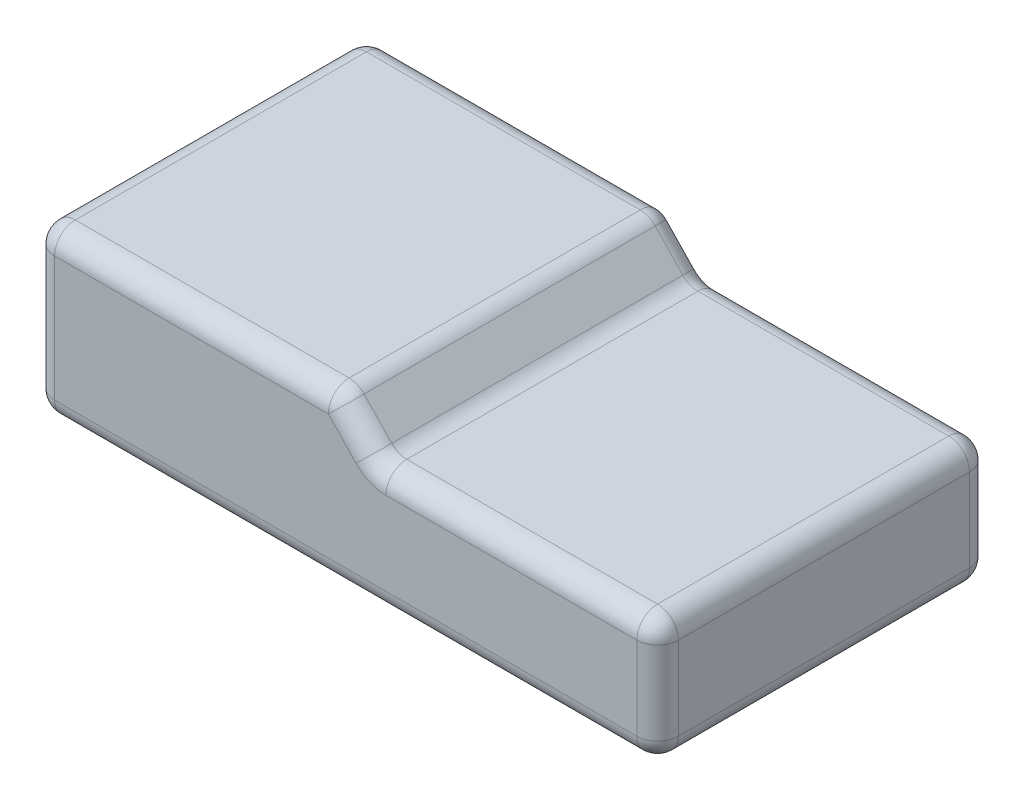
ISO-10303-21;
HEADER;
FILE_DESCRIPTION(('STEP AP214'),'2;1');
FILE_NAME('part.step','',(''),(''),'','','');
FILE_SCHEMA(('AUTOMOTIVE_DESIGN { 1 0 10303 214 1 1 1 1 }'));
ENDSEC;
DATA;
#1=APPLICATION_CONTEXT('core data for automotive mechanical design processes');
#2=APPLICATION_PROTOCOL_DEFINITION('international standard','automotive_design',2000,#1);
#3=PRODUCT_CONTEXT('',#1,'mechanical');
#4=PRODUCT('Part','Part','',(#3));
#5=PRODUCT_RELATED_PRODUCT_CATEGORY('part','',(#4));
#6=PRODUCT_DEFINITION_FORMATION('','',#4);
#7=PRODUCT_DEFINITION_CONTEXT('part definition',#1,'design');
#8=PRODUCT_DEFINITION('design','',#6,#7);
#9=PRODUCT_DEFINITION_SHAPE('','',#8);
#10=(LENGTH_UNIT() NAMED_UNIT(*) SI_UNIT(.MILLI.,.METRE.));
#11=(NAMED_UNIT(*) PLANE_ANGLE_UNIT() SI_UNIT($,.RADIAN.));
#12=(NAMED_UNIT(*) SI_UNIT($,.STERADIAN.) SOLID_ANGLE_UNIT());
#13=UNCERTAINTY_MEASURE_WITH_UNIT(LENGTH_MEASURE(1.E-05),#10,'distance_accuracy_value','');
#14=(GEOMETRIC_REPRESENTATION_CONTEXT(3) GLOBAL_UNCERTAINTY_ASSIGNED_CONTEXT((#13)) GLOBAL_UNIT_ASSIGNED_CONTEXT((#10,
#11,#12)) REPRESENTATION_CONTEXT('',''));
#15=CARTESIAN_POINT('',(0.,0.,0.));
#16=DIRECTION('',(0.,0.,1.));
#17=DIRECTION('',(1.,0.,0.));
#18=AXIS2_PLACEMENT_3D('',#15,#16,#17);
#19=CARTESIAN_POINT('',(38.1,0.,20.32));
#20=DIRECTION('',(0.,1.,0.));
#21=DIRECTION('',(0.,0.,1.));
#22=AXIS2_PLACEMENT_3D('',#19,#20,#21);
#23=PLANE('',#22);
#24=DIRECTION('',(0.,0.,-1.));
#25=VECTOR('',#24,1.);
#26=CARTESIAN_POINT('',(1.27,0.,20.32));
#27=LINE('',#26,#25);
#28=CARTESIAN_POINT('',(1.27,0.,19.05));
#29=VERTEX_POINT('',#28);
#30=CARTESIAN_POINT('',(1.27,0.,1.27));
#31=VERTEX_POINT('',#30);
#32=EDGE_CURVE('E360',#29,#31,#27,.T.);
#33=ORIENTED_EDGE('',*,*,#32,.T.);
#34=DIRECTION('',(1.,0.,0.));
#35=VECTOR('',#34,1.);
#36=CARTESIAN_POINT('',(38.1,0.,1.27));
#37=LINE('',#36,#35);
#38=CARTESIAN_POINT('',(36.83,0.,1.27));
#39=VERTEX_POINT('',#38);
#40=EDGE_CURVE('E363',#31,#39,#37,.T.);
#41=ORIENTED_EDGE('',*,*,#40,.T.);
#42=DIRECTION('',(0.,0.,-1.));
#43=VECTOR('',#42,1.);
#44=CARTESIAN_POINT('',(36.83,0.,20.32));
#45=LINE('',#44,#43);
#46=CARTESIAN_POINT('',(36.83,0.,19.05));
#47=VERTEX_POINT('',#46);
#48=EDGE_CURVE('E358',#39,#47,#45,.F.);
#49=ORIENTED_EDGE('',*,*,#48,.T.);
#50=DIRECTION('',(1.,0.,0.));
#51=VECTOR('',#50,1.);
#52=CARTESIAN_POINT('',(38.1,0.,19.05));
#53=LINE('',#52,#51);
#54=EDGE_CURVE('E294',#47,#29,#53,.F.);
#55=ORIENTED_EDGE('',*,*,#54,.T.);
#56=EDGE_LOOP('',(#33,#41,#49,#55));
#57=FACE_BOUND('',#56,.T.);
#58=ADVANCED_FACE('F35',(#57),#23,.F.);
#59=CARTESIAN_POINT('',(38.1,7.62,20.32));
#60=DIRECTION('',(-1.,0.,0.));
#61=DIRECTION('',(0.,0.,1.));
#62=AXIS2_PLACEMENT_3D('',#59,#60,#61);
#63=PLANE('',#62);
#64=DIRECTION('',(0.,0.,-1.));
#65=VECTOR('',#64,1.);
#66=CARTESIAN_POINT('',(38.1,1.27,20.32));
#67=LINE('',#66,#65);
#68=CARTESIAN_POINT('',(38.1,1.27,19.05));
#69=VERTEX_POINT('',#68);
#70=CARTESIAN_POINT('',(38.1,1.27,1.27));
#71=VERTEX_POINT('',#70);
#72=EDGE_CURVE('E377',#69,#71,#67,.T.);
#73=ORIENTED_EDGE('',*,*,#72,.T.);
#74=DIRECTION('',(0.,1.,0.));
#75=VECTOR('',#74,1.);
#76=CARTESIAN_POINT('',(38.1,7.62,1.27));
#77=LINE('',#76,#75);
#78=CARTESIAN_POINT('',(38.1,6.35,1.27));
#79=VERTEX_POINT('',#78);
#80=EDGE_CURVE('E380',#71,#79,#77,.T.);
#81=ORIENTED_EDGE('',*,*,#80,.T.);
#82=DIRECTION('',(0.,0.,-1.));
#83=VECTOR('',#82,1.);
#84=CARTESIAN_POINT('',(38.1,6.35,20.32));
#85=LINE('',#84,#83);
#86=CARTESIAN_POINT('',(38.1,6.35,19.05));
#87=VERTEX_POINT('',#86);
#88=EDGE_CURVE('E375',#79,#87,#85,.F.);
#89=ORIENTED_EDGE('',*,*,#88,.T.);
#90=DIRECTION('',(0.,1.,0.));
#91=VECTOR('',#90,1.);
#92=CARTESIAN_POINT('',(38.1,7.62,19.05));
#93=LINE('',#92,#91);
#94=EDGE_CURVE('E373',#87,#69,#93,.F.);
#95=ORIENTED_EDGE('',*,*,#94,.T.);
#96=EDGE_LOOP('',(#73,#81,#89,#95));
#97=FACE_BOUND('',#96,.T.);
#98=ADVANCED_FACE('F425',(#97),#63,.F.);
#99=CARTESIAN_POINT('',(20.9680593356964,7.62,20.32));
#100=DIRECTION('',(0.,-1.,0.));
#101=DIRECTION('',(0.,0.,-1.));
#102=AXIS2_PLACEMENT_3D('',#99,#100,#101);
#103=PLANE('',#102);
#104=DIRECTION('',(0.,0.,-1.));
#105=VECTOR('',#104,1.);
#106=CARTESIAN_POINT('',(36.83,7.62,20.32));
#107=LINE('',#106,#105);
#108=CARTESIAN_POINT('',(36.83,7.62,19.05));
#109=VERTEX_POINT('',#108);
#110=CARTESIAN_POINT('',(36.83,7.62,1.27));
#111=VERTEX_POINT('',#110);
#112=EDGE_CURVE('E343',#109,#111,#107,.T.);
#113=ORIENTED_EDGE('',*,*,#112,.T.);
#114=DIRECTION('',(-1.,0.,0.));
#115=VECTOR('',#114,1.);
#116=CARTESIAN_POINT('',(20.9680593356964,7.62,1.27));
#117=LINE('',#116,#115);
#118=CARTESIAN_POINT('',(21.509581964077,7.62,1.27));
#119=VERTEX_POINT('',#118);
#120=EDGE_CURVE('E349',#111,#119,#117,.T.);
#121=ORIENTED_EDGE('',*,*,#120,.T.);
#122=DIRECTION('',(0.,0.,-1.));
#123=VECTOR('',#122,1.);
#124=CARTESIAN_POINT('',(21.509581964077,7.62,20.32));
#125=LINE('',#124,#123);
#126=CARTESIAN_POINT('',(21.509581964077,7.62,19.05));
#127=VERTEX_POINT('',#126);
#128=EDGE_CURVE('E346',#119,#127,#125,.F.);
#129=ORIENTED_EDGE('',*,*,#128,.T.);
#130=DIRECTION('',(-1.,0.,0.));
#131=VECTOR('',#130,1.);
#132=CARTESIAN_POINT('',(20.9680593356964,7.62,19.05));
#133=LINE('',#132,#131);
#134=EDGE_CURVE('E337',#127,#109,#133,.F.);
#135=ORIENTED_EDGE('',*,*,#134,.T.);
#136=EDGE_LOOP('',(#113,#121,#129,#135));
#137=FACE_BOUND('',#136,.T.);
#138=ADVANCED_FACE('F347',(#137),#103,.F.);
#139=CARTESIAN_POINT('',(18.5311284046692,10.16,20.32));
#140=DIRECTION('',(-0.72159579056583,-0.692314606979858,0.));
#141=DIRECTION('',(0.692314606979858,-0.72159579056583,0.));
#142=AXIS2_PLACEMENT_3D('',#139,#140,#141);
#143=PLANE('',#142);
#144=DIRECTION('',(-0.692314606979858,0.72159579056583,0.));
#145=VECTOR('',#144,1.);
#146=CARTESIAN_POINT('',(18.5311284046692,10.16,19.05));
#147=LINE('',#146,#145);
#148=CARTESIAN_POINT('',(18.9060324303073,9.76923955086442,19.05));
#149=VERTEX_POINT('',#148);
#150=CARTESIAN_POINT('',(20.5931553100584,8.01076044913558,19.05));
#151=VERTEX_POINT('',#150);
#152=EDGE_CURVE('E176',#149,#151,#147,.F.);
#153=ORIENTED_EDGE('',*,*,#152,.T.);
#154=DIRECTION('',(0.,0.,-1.));
#155=VECTOR('',#154,1.);
#156=CARTESIAN_POINT('',(20.5931553100584,8.01076044913558,0.));
#157=LINE('',#156,#155);
#158=CARTESIAN_POINT('',(20.5931553100584,8.01076044913558,1.27));
#159=VERTEX_POINT('',#158);
#160=EDGE_CURVE('E172',#151,#159,#157,.T.);
#161=ORIENTED_EDGE('',*,*,#160,.T.);
#162=DIRECTION('',(-0.692314606979858,0.72159579056583,0.));
#163=VECTOR('',#162,1.);
#164=CARTESIAN_POINT('',(18.5311284046692,10.16,1.27));
#165=LINE('',#164,#163);
#166=CARTESIAN_POINT('',(18.9060324303073,9.76923955086442,1.27));
#167=VERTEX_POINT('',#166);
#168=EDGE_CURVE('E166',#159,#167,#165,.T.);
#169=ORIENTED_EDGE('',*,*,#168,.T.);
#170=DIRECTION('',(0.,0.,-1.));
#171=VECTOR('',#170,1.);
#172=CARTESIAN_POINT('',(18.9060324303073,9.76923955086442,20.32));
#173=LINE('',#172,#171);
#174=EDGE_CURVE('E169',#167,#149,#173,.F.);
#175=ORIENTED_EDGE('',*,*,#174,.T.);
#176=EDGE_LOOP('',(#153,#161,#169,#175));
#177=FACE_BOUND('',#176,.T.);
#178=ADVANCED_FACE('F168',(#177),#143,.F.);
#179=CARTESIAN_POINT('',(0.,10.16,20.32));
#180=DIRECTION('',(0.,-1.,0.));
#181=DIRECTION('',(0.,0.,-1.));
#182=AXIS2_PLACEMENT_3D('',#179,#180,#181);
#183=PLANE('',#182);
#184=DIRECTION('',(-1.,0.,0.));
#185=VECTOR('',#184,1.);
#186=CARTESIAN_POINT('',(0.,10.16,19.05));
#187=LINE('',#186,#185);
#188=CARTESIAN_POINT('',(1.27,10.16,19.05));
#189=VERTEX_POINT('',#188);
#190=CARTESIAN_POINT('',(17.9896057762887,10.16,19.05));
#191=VERTEX_POINT('',#190);
#192=EDGE_CURVE('E44',#189,#191,#187,.F.);
#193=ORIENTED_EDGE('',*,*,#192,.T.);
#194=DIRECTION('',(0.,0.,-1.));
#195=VECTOR('',#194,1.);
#196=CARTESIAN_POINT('',(17.9896057762887,10.16,20.32));
#197=LINE('',#196,#195);
#198=CARTESIAN_POINT('',(17.9896057762887,10.16,1.27));
#199=VERTEX_POINT('',#198);
#200=EDGE_CURVE('E11',#191,#199,#197,.T.);
#201=ORIENTED_EDGE('',*,*,#200,.T.);
#202=DIRECTION('',(-1.,0.,0.));
#203=VECTOR('',#202,1.);
#204=CARTESIAN_POINT('',(0.,10.16,1.27));
#205=LINE('',#204,#203);
#206=CARTESIAN_POINT('',(1.27,10.16,1.27));
#207=VERTEX_POINT('',#206);
#208=EDGE_CURVE('E313',#199,#207,#205,.T.);
#209=ORIENTED_EDGE('',*,*,#208,.T.);
#210=DIRECTION('',(0.,0.,-1.));
#211=VECTOR('',#210,1.);
#212=CARTESIAN_POINT('',(1.27,10.16,20.32));
#213=LINE('',#212,#211);
#214=EDGE_CURVE('E55',#207,#189,#213,.F.);
#215=ORIENTED_EDGE('',*,*,#214,.T.);
#216=EDGE_LOOP('',(#193,#201,#209,#215));
#217=FACE_BOUND('',#216,.T.);
#218=ADVANCED_FACE('F466',(#217),#183,.F.);
#219=CARTESIAN_POINT('',(0.,0.,20.32));
#220=DIRECTION('',(1.,0.,0.));
#221=DIRECTION('',(0.,0.,-1.));
#222=AXIS2_PLACEMENT_3D('',#219,#220,#221);
#223=PLANE('',#222);
#224=DIRECTION('',(0.,-1.,0.));
#225=VECTOR('',#224,1.);
#226=CARTESIAN_POINT('',(0.,0.,1.27));
#227=LINE('',#226,#225);
#228=CARTESIAN_POINT('',(0.,8.89,1.27));
#229=VERTEX_POINT('',#228);
#230=CARTESIAN_POINT('',(0.,1.27,1.27));
#231=VERTEX_POINT('',#230);
#232=EDGE_CURVE('E369',#229,#231,#227,.T.);
#233=ORIENTED_EDGE('',*,*,#232,.T.);
#234=DIRECTION('',(0.,0.,-1.));
#235=VECTOR('',#234,1.);
#236=CARTESIAN_POINT('',(0.,1.27,20.32));
#237=LINE('',#236,#235);
#238=CARTESIAN_POINT('',(0.,1.27,19.05));
#239=VERTEX_POINT('',#238);
#240=EDGE_CURVE('E371',#231,#239,#237,.F.);
#241=ORIENTED_EDGE('',*,*,#240,.T.);
#242=DIRECTION('',(0.,-1.,0.));
#243=VECTOR('',#242,1.);
#244=CARTESIAN_POINT('',(0.,0.,19.05));
#245=LINE('',#244,#243);
#246=CARTESIAN_POINT('',(0.,8.89,19.05));
#247=VERTEX_POINT('',#246);
#248=EDGE_CURVE('E367',#239,#247,#245,.F.);
#249=ORIENTED_EDGE('',*,*,#248,.T.);
#250=DIRECTION('',(0.,0.,-1.));
#251=VECTOR('',#250,1.);
#252=CARTESIAN_POINT('',(0.,8.89,20.32));
#253=LINE('',#252,#251);
#254=EDGE_CURVE('E365',#247,#229,#253,.T.);
#255=ORIENTED_EDGE('',*,*,#254,.T.);
#256=EDGE_LOOP('',(#233,#241,#249,#255));
#257=FACE_BOUND('',#256,.T.);
#258=ADVANCED_FACE('F468',(#257),#223,.F.);
#259=CARTESIAN_POINT('',(0.,0.,20.32));
#260=DIRECTION('',(0.,0.,-1.));
#261=DIRECTION('',(-1.,0.,0.));
#262=AXIS2_PLACEMENT_3D('',#259,#260,#261);
#263=PLANE('',#262);
#264=DIRECTION('',(0.,1.,0.));
#265=VECTOR('',#264,1.);
#266=CARTESIAN_POINT('',(36.83,0.,20.32));
#267=LINE('',#266,#265);
#268=CARTESIAN_POINT('',(36.83,1.27,20.32));
#269=VERTEX_POINT('',#268);
#270=CARTESIAN_POINT('',(36.83,6.35,20.32));
#271=VERTEX_POINT('',#270);
#272=EDGE_CURVE('E300',#269,#271,#267,.T.);
#273=ORIENTED_EDGE('',*,*,#272,.T.);
#274=DIRECTION('',(-1.,0.,0.));
#275=VECTOR('',#274,1.);
#276=CARTESIAN_POINT('',(0.,6.35,20.32));
#277=LINE('',#276,#275);
#278=CARTESIAN_POINT('',(21.509581964077,6.35,20.32));
#279=VERTEX_POINT('',#278);
#280=EDGE_CURVE('E311',#271,#279,#277,.T.);
#281=ORIENTED_EDGE('',*,*,#280,.T.);
#282=CARTESIAN_POINT('',(21.509581964077,8.89,20.32));
#283=DIRECTION('',(0.,0.,-1.));
#284=DIRECTION('',(-1.,0.,0.));
#285=AXIS2_PLACEMENT_3D('',#282,#283,#284);
#286=CIRCLE('',#285,2.54);
#287=CARTESIAN_POINT('',(19.6767286560398,7.13152089827116,20.32));
#288=VERTEX_POINT('',#287);
#289=EDGE_CURVE('E303',#288,#279,#286,.F.);
#290=ORIENTED_EDGE('',*,*,#289,.F.);
#291=DIRECTION('',(-0.692314606979858,0.72159579056583,0.));
#292=VECTOR('',#291,1.);
#293=CARTESIAN_POINT('',(13.8083853636138,13.2480635433593,20.32));
#294=LINE('',#293,#292);
#295=CARTESIAN_POINT('',(17.9896057762887,8.89,20.32));
#296=VERTEX_POINT('',#295);
#297=EDGE_CURVE('E305',#288,#296,#294,.T.);
#298=ORIENTED_EDGE('',*,*,#297,.T.);
#299=DIRECTION('',(-1.,0.,0.));
#300=VECTOR('',#299,1.);
#301=CARTESIAN_POINT('',(0.,8.89,20.32));
#302=LINE('',#301,#300);
#303=CARTESIAN_POINT('',(1.27,8.89,20.32));
#304=VERTEX_POINT('',#303);
#305=EDGE_CURVE('E397',#296,#304,#302,.T.);
#306=ORIENTED_EDGE('',*,*,#305,.T.);
#307=DIRECTION('',(0.,-1.,0.));
#308=VECTOR('',#307,1.);
#309=CARTESIAN_POINT('',(1.27,0.,20.32));
#310=LINE('',#309,#308);
#311=CARTESIAN_POINT('',(1.27,1.27,20.32));
#312=VERTEX_POINT('',#311);
#313=EDGE_CURVE('E301',#304,#312,#310,.T.);
#314=ORIENTED_EDGE('',*,*,#313,.T.);
#315=DIRECTION('',(1.,0.,0.));
#316=VECTOR('',#315,1.);
#317=CARTESIAN_POINT('',(0.,1.27,20.32));
#318=LINE('',#317,#316);
#319=EDGE_CURVE('E296',#312,#269,#318,.T.);
#320=ORIENTED_EDGE('',*,*,#319,.T.);
#321=EDGE_LOOP('',(#273,#281,#290,#298,#306,#314,#320));
#322=FACE_BOUND('',#321,.T.);
#323=ADVANCED_FACE('F400',(#322),#263,.F.);
#324=CARTESIAN_POINT('',(0.,0.,0.));
#325=DIRECTION('',(0.,0.,-1.));
#326=DIRECTION('',(-1.,0.,0.));
#327=AXIS2_PLACEMENT_3D('',#324,#325,#326);
#328=PLANE('',#327);
#329=DIRECTION('',(-1.,0.,0.));
#330=VECTOR('',#329,1.);
#331=CARTESIAN_POINT('',(38.1,6.35,0.));
#332=LINE('',#331,#330);
#333=CARTESIAN_POINT('',(21.509581964077,6.35,0.));
#334=VERTEX_POINT('',#333);
#335=CARTESIAN_POINT('',(36.83,6.35,0.));
#336=VERTEX_POINT('',#335);
#337=EDGE_CURVE('E392',#334,#336,#332,.F.);
#338=ORIENTED_EDGE('',*,*,#337,.T.);
#339=DIRECTION('',(0.,1.,0.));
#340=VECTOR('',#339,1.);
#341=CARTESIAN_POINT('',(36.83,0.,0.));
#342=LINE('',#341,#340);
#343=CARTESIAN_POINT('',(36.83,1.27,0.));
#344=VERTEX_POINT('',#343);
#345=EDGE_CURVE('E394',#336,#344,#342,.F.);
#346=ORIENTED_EDGE('',*,*,#345,.T.);
#347=DIRECTION('',(1.,0.,0.));
#348=VECTOR('',#347,1.);
#349=CARTESIAN_POINT('',(0.,1.27,0.));
#350=LINE('',#349,#348);
#351=CARTESIAN_POINT('',(1.27,1.27,0.));
#352=VERTEX_POINT('',#351);
#353=EDGE_CURVE('E387',#344,#352,#350,.F.);
#354=ORIENTED_EDGE('',*,*,#353,.T.);
#355=DIRECTION('',(0.,-1.,0.));
#356=VECTOR('',#355,1.);
#357=CARTESIAN_POINT('',(1.27,10.16,0.));
#358=LINE('',#357,#356);
#359=CARTESIAN_POINT('',(1.27,8.89,0.));
#360=VERTEX_POINT('',#359);
#361=EDGE_CURVE('E384',#352,#360,#358,.F.);
#362=ORIENTED_EDGE('',*,*,#361,.T.);
#363=DIRECTION('',(-1.,0.,0.));
#364=VECTOR('',#363,1.);
#365=CARTESIAN_POINT('',(18.5311284046692,8.89,0.));
#366=LINE('',#365,#364);
#367=CARTESIAN_POINT('',(17.9896057762887,8.89,0.));
#368=VERTEX_POINT('',#367);
#369=EDGE_CURVE('E382',#360,#368,#366,.F.);
#370=ORIENTED_EDGE('',*,*,#369,.T.);
#371=DIRECTION('',(-0.692314606979858,0.72159579056583,0.));
#372=VECTOR('',#371,1.);
#373=CARTESIAN_POINT('',(20.0516326816778,6.74076044913558,0.));
#374=LINE('',#373,#372);
#375=CARTESIAN_POINT('',(19.6767286560398,7.13152089827116,0.));
#376=VERTEX_POINT('',#375);
#377=EDGE_CURVE('E197',#368,#376,#374,.F.);
#378=ORIENTED_EDGE('',*,*,#377,.T.);
#379=CARTESIAN_POINT('',(21.509581964077,8.89,0.));
#380=DIRECTION('',(0.,0.,-1.));
#381=DIRECTION('',(-1.,0.,0.));
#382=AXIS2_PLACEMENT_3D('',#379,#380,#381);
#383=CIRCLE('',#382,2.54);
#384=EDGE_CURVE('E389',#334,#376,#383,.T.);
#385=ORIENTED_EDGE('',*,*,#384,.F.);
#386=EDGE_LOOP('',(#338,#346,#354,#362,#370,#378,#385));
#387=FACE_BOUND('',#386,.T.);
#388=ADVANCED_FACE('F458',(#387),#328,.T.);
#389=CARTESIAN_POINT('',(1.27,1.27,20.32));
#390=DIRECTION('',(0.,0.,-1.));
#391=DIRECTION('',(-1.,0.,0.));
#392=AXIS2_PLACEMENT_3D('',#389,#390,#391);
#393=CYLINDRICAL_SURFACE('',#392,1.27);
#394=CARTESIAN_POINT('',(1.27,1.27,19.05));
#395=DIRECTION('',(0.,0.,1.));
#396=DIRECTION('',(1.,0.,0.));
#397=AXIS2_PLACEMENT_3D('',#394,#395,#396);
#398=CIRCLE('',#397,1.27);
#399=EDGE_CURVE('E39',#239,#29,#398,.T.);
#400=ORIENTED_EDGE('',*,*,#399,.F.);
#401=ORIENTED_EDGE('',*,*,#240,.F.);
#402=CARTESIAN_POINT('',(1.27,1.27,1.27));
#403=DIRECTION('',(0.,0.,-1.));
#404=DIRECTION('',(-1.,0.,0.));
#405=AXIS2_PLACEMENT_3D('',#402,#403,#404);
#406=CIRCLE('',#405,1.27);
#407=EDGE_CURVE('E274',#31,#231,#406,.T.);
#408=ORIENTED_EDGE('',*,*,#407,.F.);
#409=ORIENTED_EDGE('',*,*,#32,.F.);
#410=EDGE_LOOP('',(#400,#401,#408,#409));
#411=FACE_BOUND('',#410,.T.);
#412=ADVANCED_FACE('F37',(#411),#393,.T.);
#413=CARTESIAN_POINT('',(1.27,1.27,19.05));
#414=DIRECTION('',(0.,0.,1.));
#415=DIRECTION('',(1.,0.,0.));
#416=AXIS2_PLACEMENT_3D('',#413,#414,#415);
#417=SPHERICAL_SURFACE('',#416,1.27);
#418=CARTESIAN_POINT('',(1.27,1.27,19.05));
#419=DIRECTION('',(0.,-1.,0.));
#420=DIRECTION('',(0.,0.,-1.));
#421=AXIS2_PLACEMENT_3D('',#418,#419,#420);
#422=CIRCLE('',#421,1.27);
#423=EDGE_CURVE('E269',#239,#312,#422,.F.);
#424=ORIENTED_EDGE('',*,*,#423,.F.);
#425=ORIENTED_EDGE('',*,*,#399,.T.);
#426=CARTESIAN_POINT('',(1.27,1.27,19.05));
#427=DIRECTION('',(-1.,0.,0.));
#428=DIRECTION('',(0.,0.,1.));
#429=AXIS2_PLACEMENT_3D('',#426,#427,#428);
#430=CIRCLE('',#429,1.27);
#431=EDGE_CURVE('E272',#312,#29,#430,.F.);
#432=ORIENTED_EDGE('',*,*,#431,.F.);
#433=EDGE_LOOP('',(#424,#425,#432));
#434=FACE_BOUND('',#433,.T.);
#435=ADVANCED_FACE('F285',(#434),#417,.T.);
#436=CARTESIAN_POINT('',(1.27,1.27,1.27));
#437=DIRECTION('',(0.,0.,1.));
#438=DIRECTION('',(1.,0.,0.));
#439=AXIS2_PLACEMENT_3D('',#436,#437,#438);
#440=SPHERICAL_SURFACE('',#439,1.27);
#441=CARTESIAN_POINT('',(1.27,1.27,1.27));
#442=DIRECTION('',(-1.,0.,0.));
#443=DIRECTION('',(0.,-1.,0.));
#444=AXIS2_PLACEMENT_3D('',#441,#442,#443);
#445=CIRCLE('',#444,1.27);
#446=EDGE_CURVE('E263',#31,#352,#445,.F.);
#447=ORIENTED_EDGE('',*,*,#446,.F.);
#448=ORIENTED_EDGE('',*,*,#407,.T.);
#449=CARTESIAN_POINT('',(1.27,1.27,1.27));
#450=DIRECTION('',(0.,-1.,0.));
#451=DIRECTION('',(0.,0.,-1.));
#452=AXIS2_PLACEMENT_3D('',#449,#450,#451);
#453=CIRCLE('',#452,1.27);
#454=EDGE_CURVE('E266',#352,#231,#453,.F.);
#455=ORIENTED_EDGE('',*,*,#454,.F.);
#456=EDGE_LOOP('',(#447,#448,#455));
#457=FACE_BOUND('',#456,.T.);
#458=ADVANCED_FACE('F528',(#457),#440,.T.);
#459=CARTESIAN_POINT('',(0.,1.27,19.05));
#460=DIRECTION('',(1.,0.,0.));
#461=DIRECTION('',(0.,0.,-1.));
#462=AXIS2_PLACEMENT_3D('',#459,#460,#461);
#463=CYLINDRICAL_SURFACE('',#462,1.27);
#464=ORIENTED_EDGE('',*,*,#431,.T.);
#465=ORIENTED_EDGE('',*,*,#54,.F.);
#466=CARTESIAN_POINT('',(36.83,1.27,19.05));
#467=DIRECTION('',(1.,0.,0.));
#468=DIRECTION('',(0.,0.,-1.));
#469=AXIS2_PLACEMENT_3D('',#466,#467,#468);
#470=CIRCLE('',#469,1.27);
#471=EDGE_CURVE('E257',#269,#47,#470,.T.);
#472=ORIENTED_EDGE('',*,*,#471,.F.);
#473=ORIENTED_EDGE('',*,*,#319,.F.);
#474=EDGE_LOOP('',(#464,#465,#472,#473));
#475=FACE_BOUND('',#474,.T.);
#476=ADVANCED_FACE('F292',(#475),#463,.T.);
#477=CARTESIAN_POINT('',(1.27,0.,19.05));
#478=DIRECTION('',(0.,-1.,0.));
#479=DIRECTION('',(0.,0.,-1.));
#480=AXIS2_PLACEMENT_3D('',#477,#478,#479);
#481=CYLINDRICAL_SURFACE('',#480,1.27);
#482=ORIENTED_EDGE('',*,*,#423,.T.);
#483=ORIENTED_EDGE('',*,*,#313,.F.);
#484=CARTESIAN_POINT('',(1.27,8.89,19.05));
#485=DIRECTION('',(0.,1.,0.));
#486=DIRECTION('',(0.,0.,1.));
#487=AXIS2_PLACEMENT_3D('',#484,#485,#486);
#488=CIRCLE('',#487,1.27);
#489=EDGE_CURVE('E254',#247,#304,#488,.T.);
#490=ORIENTED_EDGE('',*,*,#489,.F.);
#491=ORIENTED_EDGE('',*,*,#248,.F.);
#492=EDGE_LOOP('',(#482,#483,#490,#491));
#493=FACE_BOUND('',#492,.T.);
#494=ADVANCED_FACE('F544',(#493),#481,.T.);
#495=CARTESIAN_POINT('',(1.27,8.89,20.32));
#496=DIRECTION('',(0.,0.,-1.));
#497=DIRECTION('',(-1.,0.,0.));
#498=AXIS2_PLACEMENT_3D('',#495,#496,#497);
#499=CYLINDRICAL_SURFACE('',#498,1.27);
#500=CARTESIAN_POINT('',(1.27,8.89,1.27));
#501=DIRECTION('',(0.,0.,-1.));
#502=DIRECTION('',(-1.,0.,0.));
#503=AXIS2_PLACEMENT_3D('',#500,#501,#502);
#504=CIRCLE('',#503,1.27);
#505=EDGE_CURVE('E248',#229,#207,#504,.T.);
#506=ORIENTED_EDGE('',*,*,#505,.F.);
#507=ORIENTED_EDGE('',*,*,#254,.F.);
#508=CARTESIAN_POINT('',(1.27,8.89,19.05));
#509=DIRECTION('',(0.,0.,1.));
#510=DIRECTION('',(1.,0.,0.));
#511=AXIS2_PLACEMENT_3D('',#508,#509,#510);
#512=CIRCLE('',#511,1.27);
#513=EDGE_CURVE('E251',#189,#247,#512,.T.);
#514=ORIENTED_EDGE('',*,*,#513,.F.);
#515=ORIENTED_EDGE('',*,*,#214,.F.);
#516=EDGE_LOOP('',(#506,#507,#514,#515));
#517=FACE_BOUND('',#516,.T.);
#518=ADVANCED_FACE('F553',(#517),#499,.T.);
#519=CARTESIAN_POINT('',(1.27,0.,1.27));
#520=DIRECTION('',(0.,1.,0.));
#521=DIRECTION('',(0.,0.,1.));
#522=AXIS2_PLACEMENT_3D('',#519,#520,#521);
#523=CYLINDRICAL_SURFACE('',#522,1.27);
#524=ORIENTED_EDGE('',*,*,#454,.T.);
#525=ORIENTED_EDGE('',*,*,#232,.F.);
#526=CARTESIAN_POINT('',(1.27,8.89,1.27));
#527=DIRECTION('',(0.,1.,0.));
#528=DIRECTION('',(0.,0.,1.));
#529=AXIS2_PLACEMENT_3D('',#526,#527,#528);
#530=CIRCLE('',#529,1.27);
#531=EDGE_CURVE('E245',#360,#229,#530,.T.);
#532=ORIENTED_EDGE('',*,*,#531,.F.);
#533=ORIENTED_EDGE('',*,*,#361,.F.);
#534=EDGE_LOOP('',(#524,#525,#532,#533));
#535=FACE_BOUND('',#534,.T.);
#536=ADVANCED_FACE('F563',(#535),#523,.T.);
#537=CARTESIAN_POINT('',(38.1,1.27,1.27));
#538=DIRECTION('',(-1.,0.,0.));
#539=DIRECTION('',(0.,0.,1.));
#540=AXIS2_PLACEMENT_3D('',#537,#538,#539);
#541=CYLINDRICAL_SURFACE('',#540,1.27);
#542=ORIENTED_EDGE('',*,*,#446,.T.);
#543=ORIENTED_EDGE('',*,*,#353,.F.);
#544=CARTESIAN_POINT('',(36.83,1.27,1.27));
#545=DIRECTION('',(1.,0.,0.));
#546=DIRECTION('',(0.,0.,-1.));
#547=AXIS2_PLACEMENT_3D('',#544,#545,#546);
#548=CIRCLE('',#547,1.27);
#549=EDGE_CURVE('E242',#39,#344,#548,.T.);
#550=ORIENTED_EDGE('',*,*,#549,.F.);
#551=ORIENTED_EDGE('',*,*,#40,.F.);
#552=EDGE_LOOP('',(#542,#543,#550,#551));
#553=FACE_BOUND('',#552,.T.);
#554=ADVANCED_FACE('F573',(#553),#541,.T.);
#555=CARTESIAN_POINT('',(36.83,1.27,20.32));
#556=DIRECTION('',(0.,0.,-1.));
#557=DIRECTION('',(-1.,0.,0.));
#558=AXIS2_PLACEMENT_3D('',#555,#556,#557);
#559=CYLINDRICAL_SURFACE('',#558,1.27);
#560=CARTESIAN_POINT('',(36.83,1.27,19.05));
#561=DIRECTION('',(0.,0.,1.));
#562=DIRECTION('',(1.,0.,0.));
#563=AXIS2_PLACEMENT_3D('',#560,#561,#562);
#564=CIRCLE('',#563,1.27);
#565=EDGE_CURVE('E260',#47,#69,#564,.T.);
#566=ORIENTED_EDGE('',*,*,#565,.F.);
#567=ORIENTED_EDGE('',*,*,#48,.F.);
#568=CARTESIAN_POINT('',(36.83,1.27,1.27));
#569=DIRECTION('',(0.,0.,-1.));
#570=DIRECTION('',(-1.,0.,0.));
#571=AXIS2_PLACEMENT_3D('',#568,#569,#570);
#572=CIRCLE('',#571,1.27);
#573=EDGE_CURVE('E239',#71,#39,#572,.T.);
#574=ORIENTED_EDGE('',*,*,#573,.F.);
#575=ORIENTED_EDGE('',*,*,#72,.F.);
#576=EDGE_LOOP('',(#566,#567,#574,#575));
#577=FACE_BOUND('',#576,.T.);
#578=ADVANCED_FACE('F583',(#577),#559,.T.);
#579=CARTESIAN_POINT('',(36.83,1.27,19.05));
#580=DIRECTION('',(0.,0.,1.));
#581=DIRECTION('',(1.,0.,0.));
#582=AXIS2_PLACEMENT_3D('',#579,#580,#581);
#583=SPHERICAL_SURFACE('',#582,1.27);
#584=ORIENTED_EDGE('',*,*,#471,.T.);
#585=ORIENTED_EDGE('',*,*,#565,.T.);
#586=CARTESIAN_POINT('',(36.83,1.27,19.05));
#587=DIRECTION('',(0.,-1.,0.));
#588=DIRECTION('',(0.,0.,-1.));
#589=AXIS2_PLACEMENT_3D('',#586,#587,#588);
#590=CIRCLE('',#589,1.27);
#591=EDGE_CURVE('E236',#269,#69,#590,.F.);
#592=ORIENTED_EDGE('',*,*,#591,.F.);
#593=EDGE_LOOP('',(#584,#585,#592));
#594=FACE_BOUND('',#593,.T.);
#595=ADVANCED_FACE('F593',(#594),#583,.T.);
#596=CARTESIAN_POINT('',(1.27,8.89,19.05));
#597=DIRECTION('',(0.,0.,1.));
#598=DIRECTION('',(1.,0.,0.));
#599=AXIS2_PLACEMENT_3D('',#596,#597,#598);
#600=SPHERICAL_SURFACE('',#599,1.27);
#601=ORIENTED_EDGE('',*,*,#513,.T.);
#602=ORIENTED_EDGE('',*,*,#489,.T.);
#603=CARTESIAN_POINT('',(1.27,8.89,19.05));
#604=DIRECTION('',(-1.,0.,0.));
#605=DIRECTION('',(0.,0.,1.));
#606=AXIS2_PLACEMENT_3D('',#603,#604,#605);
#607=CIRCLE('',#606,1.27);
#608=EDGE_CURVE('E233',#189,#304,#607,.F.);
#609=ORIENTED_EDGE('',*,*,#608,.F.);
#610=EDGE_LOOP('',(#601,#602,#609));
#611=FACE_BOUND('',#610,.T.);
#612=ADVANCED_FACE('F603',(#611),#600,.T.);
#613=CARTESIAN_POINT('',(1.27,8.89,1.27));
#614=DIRECTION('',(0.,0.,1.));
#615=DIRECTION('',(1.,0.,0.));
#616=AXIS2_PLACEMENT_3D('',#613,#614,#615);
#617=SPHERICAL_SURFACE('',#616,1.27);
#618=ORIENTED_EDGE('',*,*,#531,.T.);
#619=ORIENTED_EDGE('',*,*,#505,.T.);
#620=CARTESIAN_POINT('',(1.27,8.89,1.27));
#621=DIRECTION('',(-1.,0.,0.));
#622=DIRECTION('',(0.,0.,1.));
#623=AXIS2_PLACEMENT_3D('',#620,#621,#622);
#624=CIRCLE('',#623,1.27);
#625=EDGE_CURVE('E230',#360,#207,#624,.F.);
#626=ORIENTED_EDGE('',*,*,#625,.F.);
#627=EDGE_LOOP('',(#618,#619,#626));
#628=FACE_BOUND('',#627,.T.);
#629=ADVANCED_FACE('F613',(#628),#617,.T.);
#630=CARTESIAN_POINT('',(36.83,1.27,1.27));
#631=DIRECTION('',(0.,0.,1.));
#632=DIRECTION('',(1.,0.,0.));
#633=AXIS2_PLACEMENT_3D('',#630,#631,#632);
#634=SPHERICAL_SURFACE('',#633,1.27);
#635=ORIENTED_EDGE('',*,*,#573,.T.);
#636=ORIENTED_EDGE('',*,*,#549,.T.);
#637=CARTESIAN_POINT('',(36.83,1.27,1.27));
#638=DIRECTION('',(0.,-1.,0.));
#639=DIRECTION('',(1.,0.,0.));
#640=AXIS2_PLACEMENT_3D('',#637,#638,#639);
#641=CIRCLE('',#640,1.27);
#642=EDGE_CURVE('E228',#71,#344,#641,.F.);
#643=ORIENTED_EDGE('',*,*,#642,.F.);
#644=EDGE_LOOP('',(#635,#636,#643));
#645=FACE_BOUND('',#644,.T.);
#646=ADVANCED_FACE('F623',(#645),#634,.T.);
#647=CARTESIAN_POINT('',(36.83,0.,19.05));
#648=DIRECTION('',(0.,1.,0.));
#649=DIRECTION('',(0.,0.,1.));
#650=AXIS2_PLACEMENT_3D('',#647,#648,#649);
#651=CYLINDRICAL_SURFACE('',#650,1.27);
#652=ORIENTED_EDGE('',*,*,#591,.T.);
#653=ORIENTED_EDGE('',*,*,#94,.F.);
#654=CARTESIAN_POINT('',(36.83,6.35,19.05));
#655=DIRECTION('',(0.,1.,0.));
#656=DIRECTION('',(0.,0.,1.));
#657=AXIS2_PLACEMENT_3D('',#654,#655,#656);
#658=CIRCLE('',#657,1.27);
#659=EDGE_CURVE('E222',#271,#87,#658,.T.);
#660=ORIENTED_EDGE('',*,*,#659,.F.);
#661=ORIENTED_EDGE('',*,*,#272,.F.);
#662=EDGE_LOOP('',(#652,#653,#660,#661));
#663=FACE_BOUND('',#662,.T.);
#664=ADVANCED_FACE('F633',(#663),#651,.T.);
#665=CARTESIAN_POINT('',(0.,8.89,19.05));
#666=DIRECTION('',(-1.,0.,0.));
#667=DIRECTION('',(0.,0.,1.));
#668=AXIS2_PLACEMENT_3D('',#665,#666,#667);
#669=CYLINDRICAL_SURFACE('',#668,1.27);
#670=ORIENTED_EDGE('',*,*,#608,.T.);
#671=ORIENTED_EDGE('',*,*,#305,.F.);
#672=CARTESIAN_POINT('',(17.9896057762887,8.89,19.05));
#673=DIRECTION('',(1.,0.,0.));
#674=DIRECTION('',(0.,0.,-1.));
#675=AXIS2_PLACEMENT_3D('',#672,#673,#674);
#676=CIRCLE('',#675,1.27);
#677=EDGE_CURVE('E219',#191,#296,#676,.T.);
#678=ORIENTED_EDGE('',*,*,#677,.F.);
#679=ORIENTED_EDGE('',*,*,#192,.F.);
#680=EDGE_LOOP('',(#670,#671,#678,#679));
#681=FACE_BOUND('',#680,.T.);
#682=ADVANCED_FACE('F406',(#681),#669,.T.);
#683=CARTESIAN_POINT('',(17.9896057762887,8.89,20.32));
#684=DIRECTION('',(0.,0.,-1.));
#685=DIRECTION('',(-1.,0.,0.));
#686=AXIS2_PLACEMENT_3D('',#683,#684,#685);
#687=CYLINDRICAL_SURFACE('',#686,1.27);
#688=CARTESIAN_POINT('',(17.9896057762887,8.89,1.27));
#689=DIRECTION('',(0.,0.,-1.));
#690=DIRECTION('',(-1.,0.,0.));
#691=AXIS2_PLACEMENT_3D('',#688,#689,#690);
#692=CIRCLE('',#691,1.27);
#693=EDGE_CURVE('E182',#199,#167,#692,.T.);
#694=ORIENTED_EDGE('',*,*,#693,.F.);
#695=ORIENTED_EDGE('',*,*,#200,.F.);
#696=CARTESIAN_POINT('',(17.9896057762887,8.89,19.05));
#697=DIRECTION('',(0.,0.,1.));
#698=DIRECTION('',(1.,0.,0.));
#699=AXIS2_PLACEMENT_3D('',#696,#697,#698);
#700=CIRCLE('',#699,1.27);
#701=EDGE_CURVE('E185',#149,#191,#700,.T.);
#702=ORIENTED_EDGE('',*,*,#701,.F.);
#703=ORIENTED_EDGE('',*,*,#174,.F.);
#704=EDGE_LOOP('',(#694,#695,#702,#703));
#705=FACE_BOUND('',#704,.T.);
#706=ADVANCED_FACE('F181',(#705),#687,.T.);
#707=CARTESIAN_POINT('',(0.,8.89,1.27));
#708=DIRECTION('',(1.,0.,0.));
#709=DIRECTION('',(0.,0.,-1.));
#710=AXIS2_PLACEMENT_3D('',#707,#708,#709);
#711=CYLINDRICAL_SURFACE('',#710,1.27);
#712=ORIENTED_EDGE('',*,*,#625,.T.);
#713=ORIENTED_EDGE('',*,*,#208,.F.);
#714=CARTESIAN_POINT('',(17.9896057762887,8.89,1.27));
#715=DIRECTION('',(1.,0.,0.));
#716=DIRECTION('',(0.,1.,0.));
#717=AXIS2_PLACEMENT_3D('',#714,#715,#716);
#718=CIRCLE('',#717,1.27);
#719=EDGE_CURVE('E194',#368,#199,#718,.T.);
#720=ORIENTED_EDGE('',*,*,#719,.F.);
#721=ORIENTED_EDGE('',*,*,#369,.F.);
#722=EDGE_LOOP('',(#712,#713,#720,#721));
#723=FACE_BOUND('',#722,.T.);
#724=ADVANCED_FACE('F464',(#723),#711,.T.);
#725=CARTESIAN_POINT('',(36.83,7.62,1.27));
#726=DIRECTION('',(0.,-1.,0.));
#727=DIRECTION('',(0.,0.,-1.));
#728=AXIS2_PLACEMENT_3D('',#725,#726,#727);
#729=CYLINDRICAL_SURFACE('',#728,1.27);
#730=ORIENTED_EDGE('',*,*,#642,.T.);
#731=ORIENTED_EDGE('',*,*,#345,.F.);
#732=CARTESIAN_POINT('',(36.83,6.35,1.27));
#733=DIRECTION('',(0.,1.,0.));
#734=DIRECTION('',(0.,0.,1.));
#735=AXIS2_PLACEMENT_3D('',#732,#733,#734);
#736=CIRCLE('',#735,1.27);
#737=EDGE_CURVE('E214',#79,#336,#736,.T.);
#738=ORIENTED_EDGE('',*,*,#737,.F.);
#739=ORIENTED_EDGE('',*,*,#80,.F.);
#740=EDGE_LOOP('',(#730,#731,#738,#739));
#741=FACE_BOUND('',#740,.T.);
#742=ADVANCED_FACE('F455',(#741),#729,.T.);
#743=CARTESIAN_POINT('',(36.83,6.35,20.32));
#744=DIRECTION('',(0.,0.,-1.));
#745=DIRECTION('',(-1.,0.,0.));
#746=AXIS2_PLACEMENT_3D('',#743,#744,#745);
#747=CYLINDRICAL_SURFACE('',#746,1.27);
#748=CARTESIAN_POINT('',(36.83,6.35,19.05));
#749=DIRECTION('',(0.,0.,1.));
#750=DIRECTION('',(1.,0.,0.));
#751=AXIS2_PLACEMENT_3D('',#748,#749,#750);
#752=CIRCLE('',#751,1.27);
#753=EDGE_CURVE('E225',#87,#109,#752,.T.);
#754=ORIENTED_EDGE('',*,*,#753,.F.);
#755=ORIENTED_EDGE('',*,*,#88,.F.);
#756=CARTESIAN_POINT('',(36.83,6.35,1.27));
#757=DIRECTION('',(0.,0.,-1.));
#758=DIRECTION('',(-1.,0.,0.));
#759=AXIS2_PLACEMENT_3D('',#756,#757,#758);
#760=CIRCLE('',#759,1.27);
#761=EDGE_CURVE('E211',#111,#79,#760,.T.);
#762=ORIENTED_EDGE('',*,*,#761,.F.);
#763=ORIENTED_EDGE('',*,*,#112,.F.);
#764=EDGE_LOOP('',(#754,#755,#762,#763));
#765=FACE_BOUND('',#764,.T.);
#766=ADVANCED_FACE('F676',(#765),#747,.T.);
#767=CARTESIAN_POINT('',(36.83,6.35,19.05));
#768=DIRECTION('',(0.,0.,1.));
#769=DIRECTION('',(1.,0.,0.));
#770=AXIS2_PLACEMENT_3D('',#767,#768,#769);
#771=SPHERICAL_SURFACE('',#770,1.27);
#772=ORIENTED_EDGE('',*,*,#659,.T.);
#773=ORIENTED_EDGE('',*,*,#753,.T.);
#774=CARTESIAN_POINT('',(36.83,6.35,19.05));
#775=DIRECTION('',(1.,0.,0.));
#776=DIRECTION('',(0.,0.,-1.));
#777=AXIS2_PLACEMENT_3D('',#774,#775,#776);
#778=CIRCLE('',#777,1.27);
#779=EDGE_CURVE('E202',#271,#109,#778,.F.);
#780=ORIENTED_EDGE('',*,*,#779,.F.);
#781=EDGE_LOOP('',(#772,#773,#780));
#782=FACE_BOUND('',#781,.T.);
#783=ADVANCED_FACE('F685',(#782),#771,.T.);
#784=CARTESIAN_POINT('',(17.9896057762887,8.89,19.05));
#785=DIRECTION('',(0.,0.,1.));
#786=DIRECTION('',(1.,0.,0.));
#787=AXIS2_PLACEMENT_3D('',#784,#785,#786);
#788=SPHERICAL_SURFACE('',#787,1.27);
#789=ORIENTED_EDGE('',*,*,#701,.T.);
#790=ORIENTED_EDGE('',*,*,#677,.T.);
#791=CARTESIAN_POINT('',(17.9896057762887,8.89,19.05));
#792=DIRECTION('',(-0.692314606979859,0.721595790565829,0.));
#793=DIRECTION('',(-0.721595790565829,-0.692314606979859,0.));
#794=AXIS2_PLACEMENT_3D('',#791,#792,#793);
#795=CIRCLE('',#794,1.27);
#796=EDGE_CURVE('E198',#149,#296,#795,.F.);
#797=ORIENTED_EDGE('',*,*,#796,.F.);
#798=EDGE_LOOP('',(#789,#790,#797));
#799=FACE_BOUND('',#798,.T.);
#800=ADVANCED_FACE('F409',(#799),#788,.T.);
#801=CARTESIAN_POINT('',(17.9896057762887,8.89,1.27));
#802=DIRECTION('',(0.,0.,1.));
#803=DIRECTION('',(1.,0.,0.));
#804=AXIS2_PLACEMENT_3D('',#801,#802,#803);
#805=SPHERICAL_SURFACE('',#804,1.27);
#806=ORIENTED_EDGE('',*,*,#719,.T.);
#807=ORIENTED_EDGE('',*,*,#693,.T.);
#808=CARTESIAN_POINT('',(17.9896057762887,8.89,1.27));
#809=DIRECTION('',(-0.692314606979858,0.72159579056583,0.));
#810=DIRECTION('',(-0.72159579056583,-0.692314606979858,0.));
#811=AXIS2_PLACEMENT_3D('',#808,#809,#810);
#812=CIRCLE('',#811,1.27);
#813=EDGE_CURVE('E191',#368,#167,#812,.F.);
#814=ORIENTED_EDGE('',*,*,#813,.F.);
#815=EDGE_LOOP('',(#806,#807,#814));
#816=FACE_BOUND('',#815,.T.);
#817=ADVANCED_FACE('F190',(#816),#805,.T.);
#818=CARTESIAN_POINT('',(36.83,6.35,1.27));
#819=DIRECTION('',(0.,0.,1.));
#820=DIRECTION('',(1.,0.,0.));
#821=AXIS2_PLACEMENT_3D('',#818,#819,#820);
#822=SPHERICAL_SURFACE('',#821,1.27);
#823=ORIENTED_EDGE('',*,*,#761,.T.);
#824=ORIENTED_EDGE('',*,*,#737,.T.);
#825=CARTESIAN_POINT('',(36.83,6.35,1.27));
#826=DIRECTION('',(1.,0.,0.));
#827=DIRECTION('',(0.,0.,-1.));
#828=AXIS2_PLACEMENT_3D('',#825,#826,#827);
#829=CIRCLE('',#828,1.27);
#830=EDGE_CURVE('E199',#111,#336,#829,.F.);
#831=ORIENTED_EDGE('',*,*,#830,.F.);
#832=EDGE_LOOP('',(#823,#824,#831));
#833=FACE_BOUND('',#832,.T.);
#834=ADVANCED_FACE('F422',(#833),#822,.T.);
#835=CARTESIAN_POINT('',(0.,6.35,19.05));
#836=DIRECTION('',(-1.,0.,0.));
#837=DIRECTION('',(0.,0.,1.));
#838=AXIS2_PLACEMENT_3D('',#835,#836,#837);
#839=CYLINDRICAL_SURFACE('',#838,1.27);
#840=ORIENTED_EDGE('',*,*,#779,.T.);
#841=ORIENTED_EDGE('',*,*,#134,.F.);
#842=CARTESIAN_POINT('',(21.509581964077,6.35,19.05));
#843=DIRECTION('',(-1.,0.,0.));
#844=DIRECTION('',(0.,0.,1.));
#845=AXIS2_PLACEMENT_3D('',#842,#843,#844);
#846=CIRCLE('',#845,1.27);
#847=EDGE_CURVE('E205',#279,#127,#846,.T.);
#848=ORIENTED_EDGE('',*,*,#847,.F.);
#849=ORIENTED_EDGE('',*,*,#280,.F.);
#850=EDGE_LOOP('',(#840,#841,#848,#849));
#851=FACE_BOUND('',#850,.T.);
#852=ADVANCED_FACE('F339',(#851),#839,.T.);
#853=CARTESIAN_POINT('',(13.8083853636138,13.2480635433593,19.05));
#854=DIRECTION('',(-0.692314606979858,0.72159579056583,0.));
#855=DIRECTION('',(-0.72159579056583,-0.692314606979858,0.));
#856=AXIS2_PLACEMENT_3D('',#853,#854,#855);
#857=CYLINDRICAL_SURFACE('',#856,1.27);
#858=ORIENTED_EDGE('',*,*,#796,.T.);
#859=ORIENTED_EDGE('',*,*,#297,.F.);
#860=CARTESIAN_POINT('',(19.6767286560398,7.13152089827116,19.05));
#861=DIRECTION('',(0.692314606979858,-0.72159579056583,0.));
#862=DIRECTION('',(0.72159579056583,0.692314606979858,0.));
#863=AXIS2_PLACEMENT_3D('',#860,#861,#862);
#864=CIRCLE('',#863,1.27);
#865=EDGE_CURVE('E327',#151,#288,#864,.T.);
#866=ORIENTED_EDGE('',*,*,#865,.F.);
#867=ORIENTED_EDGE('',*,*,#152,.F.);
#868=EDGE_LOOP('',(#858,#859,#866,#867));
#869=FACE_BOUND('',#868,.T.);
#870=ADVANCED_FACE('F411',(#869),#857,.T.);
#871=CARTESIAN_POINT('',(17.6147017506506,9.28076044913558,1.27));
#872=DIRECTION('',(0.692314606979858,-0.72159579056583,0.));
#873=DIRECTION('',(0.72159579056583,0.692314606979858,0.));
#874=AXIS2_PLACEMENT_3D('',#871,#872,#873);
#875=CYLINDRICAL_SURFACE('',#874,1.27);
#876=ORIENTED_EDGE('',*,*,#813,.T.);
#877=ORIENTED_EDGE('',*,*,#168,.F.);
#878=CARTESIAN_POINT('',(19.6767286560398,7.13152089827116,1.27));
#879=DIRECTION('',(0.692314606979858,-0.72159579056583,0.));
#880=DIRECTION('',(0.72159579056583,0.692314606979858,0.));
#881=AXIS2_PLACEMENT_3D('',#878,#879,#880);
#882=CIRCLE('',#881,1.27);
#883=EDGE_CURVE('E324',#376,#159,#882,.T.);
#884=ORIENTED_EDGE('',*,*,#883,.F.);
#885=ORIENTED_EDGE('',*,*,#377,.F.);
#886=EDGE_LOOP('',(#876,#877,#884,#885));
#887=FACE_BOUND('',#886,.T.);
#888=ADVANCED_FACE('F196',(#887),#875,.T.);
#889=CARTESIAN_POINT('',(20.9680593356964,6.35,1.27));
#890=DIRECTION('',(1.,0.,0.));
#891=DIRECTION('',(0.,0.,-1.));
#892=AXIS2_PLACEMENT_3D('',#889,#890,#891);
#893=CYLINDRICAL_SURFACE('',#892,1.27);
#894=ORIENTED_EDGE('',*,*,#830,.T.);
#895=ORIENTED_EDGE('',*,*,#337,.F.);
#896=CARTESIAN_POINT('',(21.509581964077,6.35,1.27));
#897=DIRECTION('',(-1.,0.,0.));
#898=DIRECTION('',(0.,0.,1.));
#899=AXIS2_PLACEMENT_3D('',#896,#897,#898);
#900=CIRCLE('',#899,1.27);
#901=EDGE_CURVE('E321',#119,#334,#900,.T.);
#902=ORIENTED_EDGE('',*,*,#901,.F.);
#903=ORIENTED_EDGE('',*,*,#120,.F.);
#904=EDGE_LOOP('',(#894,#895,#902,#903));
#905=FACE_BOUND('',#904,.T.);
#906=ADVANCED_FACE('F420',(#905),#893,.T.);
#907=CARTESIAN_POINT('',(21.509581964077,8.89,19.05));
#908=DIRECTION('',(0.,0.,-1.));
#909=DIRECTION('',(-1.,0.,0.));
#910=AXIS2_PLACEMENT_3D('',#907,#908,#909);
#911=TOROIDAL_SURFACE('',#910,2.54,1.27);
#912=ORIENTED_EDGE('',*,*,#289,.T.);
#913=ORIENTED_EDGE('',*,*,#847,.T.);
#914=CARTESIAN_POINT('',(21.509581964077,8.89,19.05));
#915=DIRECTION('',(0.,0.,-1.));
#916=DIRECTION('',(-1.,0.,0.));
#917=AXIS2_PLACEMENT_3D('',#914,#915,#916);
#918=CIRCLE('',#917,1.27);
#919=EDGE_CURVE('E319',#151,#127,#918,.F.);
#920=ORIENTED_EDGE('',*,*,#919,.F.);
#921=ORIENTED_EDGE('',*,*,#865,.T.);
#922=EDGE_LOOP('',(#912,#913,#920,#921));
#923=FACE_BOUND('',#922,.T.);
#924=ADVANCED_FACE('F334',(#923),#911,.T.);
#925=CARTESIAN_POINT('',(21.509581964077,8.89,1.27));
#926=DIRECTION('',(0.,0.,-1.));
#927=DIRECTION('',(-1.,0.,0.));
#928=AXIS2_PLACEMENT_3D('',#925,#926,#927);
#929=TOROIDAL_SURFACE('',#928,2.54,1.27);
#930=ORIENTED_EDGE('',*,*,#384,.T.);
#931=ORIENTED_EDGE('',*,*,#883,.T.);
#932=CARTESIAN_POINT('',(21.509581964077,8.89,1.27));
#933=DIRECTION('',(0.,0.,-1.));
#934=DIRECTION('',(-1.,0.,0.));
#935=AXIS2_PLACEMENT_3D('',#932,#933,#934);
#936=CIRCLE('',#935,1.27);
#937=EDGE_CURVE('E317',#119,#159,#936,.T.);
#938=ORIENTED_EDGE('',*,*,#937,.F.);
#939=ORIENTED_EDGE('',*,*,#901,.T.);
#940=EDGE_LOOP('',(#930,#931,#938,#939));
#941=FACE_BOUND('',#940,.T.);
#942=ADVANCED_FACE('F438',(#941),#929,.T.);
#943=CARTESIAN_POINT('',(21.509581964077,8.89,20.32));
#944=DIRECTION('',(0.,0.,1.));
#945=DIRECTION('',(1.,0.,0.));
#946=AXIS2_PLACEMENT_3D('',#943,#944,#945);
#947=CYLINDRICAL_SURFACE('',#946,1.27);
#948=ORIENTED_EDGE('',*,*,#919,.T.);
#949=ORIENTED_EDGE('',*,*,#128,.F.);
#950=ORIENTED_EDGE('',*,*,#937,.T.);
#951=ORIENTED_EDGE('',*,*,#160,.F.);
#952=EDGE_LOOP('',(#948,#949,#950,#951));
#953=FACE_BOUND('',#952,.T.);
#954=ADVANCED_FACE('F435',(#953),#947,.F.);
#955=CLOSED_SHELL('',(#58,#98,#138,#178,#218,#258,#323,#388,#412,#435,#458,#476,#494,#518,#536,
#554,#578,#595,#612,#629,#646,#664,#682,#706,#724,#742,#766,#783,#800,#817,#834,#852,#870,#888,
#906,#924,#942,#954));
#956=MANIFOLD_SOLID_BREP('B2',#955);
#957=ADVANCED_BREP_SHAPE_REPRESENTATION('',(#18,#956),#14);
#958=SHAPE_DEFINITION_REPRESENTATION(#9,#957);
ENDSEC;
END-ISO-10303-21;
